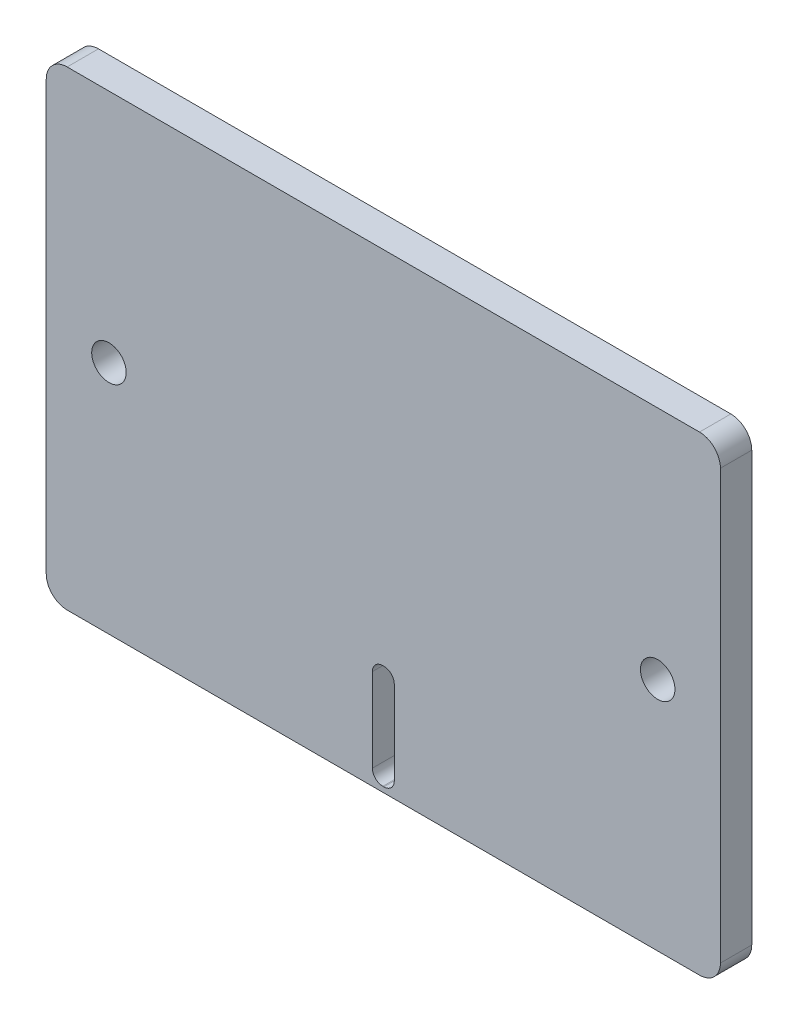
ISO-10303-21;
HEADER;
FILE_DESCRIPTION(('STEP AP214'),'2;1');
FILE_NAME('part.step','',(''),(''),'','','');
FILE_SCHEMA(('AUTOMOTIVE_DESIGN { 1 0 10303 214 1 1 1 1 }'));
ENDSEC;
DATA;
#1=APPLICATION_CONTEXT('core data for automotive mechanical design processes');
#2=APPLICATION_PROTOCOL_DEFINITION('international standard','automotive_design',2000,#1);
#3=PRODUCT_CONTEXT('',#1,'mechanical');
#4=PRODUCT('Part','Part','',(#3));
#5=PRODUCT_RELATED_PRODUCT_CATEGORY('part','',(#4));
#6=PRODUCT_DEFINITION_FORMATION('','',#4);
#7=PRODUCT_DEFINITION_CONTEXT('part definition',#1,'design');
#8=PRODUCT_DEFINITION('design','',#6,#7);
#9=PRODUCT_DEFINITION_SHAPE('','',#8);
#10=(LENGTH_UNIT() NAMED_UNIT(*) SI_UNIT(.MILLI.,.METRE.));
#11=(NAMED_UNIT(*) PLANE_ANGLE_UNIT() SI_UNIT($,.RADIAN.));
#12=(NAMED_UNIT(*) SI_UNIT($,.STERADIAN.) SOLID_ANGLE_UNIT());
#13=UNCERTAINTY_MEASURE_WITH_UNIT(LENGTH_MEASURE(1.E-05),#10,'distance_accuracy_value','');
#14=(GEOMETRIC_REPRESENTATION_CONTEXT(3) GLOBAL_UNCERTAINTY_ASSIGNED_CONTEXT((#13)) GLOBAL_UNIT_ASSIGNED_CONTEXT((#10,
#11,#12)) REPRESENTATION_CONTEXT('',''));
#15=CARTESIAN_POINT('',(0.,0.,0.));
#16=DIRECTION('',(0.,0.,1.));
#17=DIRECTION('',(1.,0.,0.));
#18=AXIS2_PLACEMENT_3D('',#15,#16,#17);
#19=CARTESIAN_POINT('',(32.25,-22.5,3.));
#20=DIRECTION('',(-1.,0.,0.));
#21=DIRECTION('',(0.,0.,1.));
#22=AXIS2_PLACEMENT_3D('',#19,#20,#21);
#23=PLANE('',#22);
#24=DIRECTION('',(0.,0.,-1.));
#25=VECTOR('',#24,1.);
#26=CARTESIAN_POINT('',(32.25,-20.5,3.));
#27=LINE('',#26,#25);
#28=CARTESIAN_POINT('',(32.25,-20.5,3.));
#29=VERTEX_POINT('',#28);
#30=CARTESIAN_POINT('',(32.25,-20.5,0.));
#31=VERTEX_POINT('',#30);
#32=EDGE_CURVE('E203',#29,#31,#27,.T.);
#33=ORIENTED_EDGE('',*,*,#32,.T.);
#34=DIRECTION('',(0.,1.,0.));
#35=VECTOR('',#34,1.);
#36=CARTESIAN_POINT('',(32.25,-22.5,0.));
#37=LINE('',#36,#35);
#38=CARTESIAN_POINT('',(32.25,20.5,0.));
#39=VERTEX_POINT('',#38);
#40=EDGE_CURVE('E181',#31,#39,#37,.T.);
#41=ORIENTED_EDGE('',*,*,#40,.T.);
#42=DIRECTION('',(0.,0.,-1.));
#43=VECTOR('',#42,1.);
#44=CARTESIAN_POINT('',(32.25,20.5,3.));
#45=LINE('',#44,#43);
#46=CARTESIAN_POINT('',(32.25,20.5,3.));
#47=VERTEX_POINT('',#46);
#48=EDGE_CURVE('E200',#39,#47,#45,.F.);
#49=ORIENTED_EDGE('',*,*,#48,.T.);
#50=DIRECTION('',(0.,1.,0.));
#51=VECTOR('',#50,1.);
#52=CARTESIAN_POINT('',(32.25,-22.5,3.));
#53=LINE('',#52,#51);
#54=EDGE_CURVE('E179',#29,#47,#53,.T.);
#55=ORIENTED_EDGE('',*,*,#54,.F.);
#56=EDGE_LOOP('',(#33,#41,#49,#55));
#57=FACE_BOUND('',#56,.T.);
#58=ADVANCED_FACE('F36',(#57),#23,.F.);
#59=CARTESIAN_POINT('',(-32.25,22.5,3.));
#60=DIRECTION('',(0.,-1.,0.));
#61=DIRECTION('',(0.,0.,-1.));
#62=AXIS2_PLACEMENT_3D('',#59,#60,#61);
#63=PLANE('',#62);
#64=DIRECTION('',(-1.,0.,0.));
#65=VECTOR('',#64,1.);
#66=CARTESIAN_POINT('',(-32.25,22.5,0.));
#67=LINE('',#66,#65);
#68=CARTESIAN_POINT('',(30.25,22.5,0.));
#69=VERTEX_POINT('',#68);
#70=CARTESIAN_POINT('',(-30.25,22.5,0.));
#71=VERTEX_POINT('',#70);
#72=EDGE_CURVE('E176',#69,#71,#67,.T.);
#73=ORIENTED_EDGE('',*,*,#72,.T.);
#74=DIRECTION('',(0.,0.,-1.));
#75=VECTOR('',#74,1.);
#76=CARTESIAN_POINT('',(-30.25,22.5,3.));
#77=LINE('',#76,#75);
#78=CARTESIAN_POINT('',(-30.25,22.5,3.));
#79=VERTEX_POINT('',#78);
#80=EDGE_CURVE('E154',#71,#79,#77,.F.);
#81=ORIENTED_EDGE('',*,*,#80,.T.);
#82=DIRECTION('',(-1.,0.,0.));
#83=VECTOR('',#82,1.);
#84=CARTESIAN_POINT('',(-32.25,22.5,3.));
#85=LINE('',#84,#83);
#86=CARTESIAN_POINT('',(30.25,22.5,3.));
#87=VERTEX_POINT('',#86);
#88=EDGE_CURVE('E313',#87,#79,#85,.T.);
#89=ORIENTED_EDGE('',*,*,#88,.F.);
#90=DIRECTION('',(0.,0.,-1.));
#91=VECTOR('',#90,1.);
#92=CARTESIAN_POINT('',(30.25,22.5,3.));
#93=LINE('',#92,#91);
#94=EDGE_CURVE('E159',#87,#69,#93,.T.);
#95=ORIENTED_EDGE('',*,*,#94,.T.);
#96=EDGE_LOOP('',(#73,#81,#89,#95));
#97=FACE_BOUND('',#96,.T.);
#98=ADVANCED_FACE('F331',(#97),#63,.F.);
#99=CARTESIAN_POINT('',(-32.25,-22.5,3.));
#100=DIRECTION('',(1.,0.,0.));
#101=DIRECTION('',(0.,0.,-1.));
#102=AXIS2_PLACEMENT_3D('',#99,#100,#101);
#103=PLANE('',#102);
#104=DIRECTION('',(0.,-1.,0.));
#105=VECTOR('',#104,1.);
#106=CARTESIAN_POINT('',(-32.25,-22.5,0.));
#107=LINE('',#106,#105);
#108=CARTESIAN_POINT('',(-32.25,20.5,0.));
#109=VERTEX_POINT('',#108);
#110=CARTESIAN_POINT('',(-32.25,-20.5,0.));
#111=VERTEX_POINT('',#110);
#112=EDGE_CURVE('E166',#109,#111,#107,.T.);
#113=ORIENTED_EDGE('',*,*,#112,.T.);
#114=DIRECTION('',(0.,0.,-1.));
#115=VECTOR('',#114,1.);
#116=CARTESIAN_POINT('',(-32.25,-20.5,3.));
#117=LINE('',#116,#115);
#118=CARTESIAN_POINT('',(-32.25,-20.5,3.));
#119=VERTEX_POINT('',#118);
#120=EDGE_CURVE('E211',#111,#119,#117,.F.);
#121=ORIENTED_EDGE('',*,*,#120,.T.);
#122=DIRECTION('',(0.,-1.,0.));
#123=VECTOR('',#122,1.);
#124=CARTESIAN_POINT('',(-32.25,-22.5,3.));
#125=LINE('',#124,#123);
#126=CARTESIAN_POINT('',(-32.25,20.5,3.));
#127=VERTEX_POINT('',#126);
#128=EDGE_CURVE('E168',#127,#119,#125,.T.);
#129=ORIENTED_EDGE('',*,*,#128,.F.);
#130=DIRECTION('',(0.,0.,-1.));
#131=VECTOR('',#130,1.);
#132=CARTESIAN_POINT('',(-32.25,20.5,3.));
#133=LINE('',#132,#131);
#134=EDGE_CURVE('E153',#127,#109,#133,.T.);
#135=ORIENTED_EDGE('',*,*,#134,.T.);
#136=EDGE_LOOP('',(#113,#121,#129,#135));
#137=FACE_BOUND('',#136,.T.);
#138=ADVANCED_FACE('F164',(#137),#103,.F.);
#139=CARTESIAN_POINT('',(-32.25,-22.5,3.));
#140=DIRECTION('',(0.,1.,0.));
#141=DIRECTION('',(0.,0.,1.));
#142=AXIS2_PLACEMENT_3D('',#139,#140,#141);
#143=PLANE('',#142);
#144=DIRECTION('',(1.,0.,0.));
#145=VECTOR('',#144,1.);
#146=CARTESIAN_POINT('',(-32.25,-22.5,0.));
#147=LINE('',#146,#145);
#148=CARTESIAN_POINT('',(-30.25,-22.5,0.));
#149=VERTEX_POINT('',#148);
#150=CARTESIAN_POINT('',(30.25,-22.5,0.));
#151=VERTEX_POINT('',#150);
#152=EDGE_CURVE('E175',#149,#151,#147,.T.);
#153=ORIENTED_EDGE('',*,*,#152,.T.);
#154=DIRECTION('',(0.,0.,-1.));
#155=VECTOR('',#154,1.);
#156=CARTESIAN_POINT('',(30.25,-22.5,3.));
#157=LINE('',#156,#155);
#158=CARTESIAN_POINT('',(30.25,-22.5,3.));
#159=VERTEX_POINT('',#158);
#160=EDGE_CURVE('E209',#151,#159,#157,.F.);
#161=ORIENTED_EDGE('',*,*,#160,.T.);
#162=DIRECTION('',(1.,0.,0.));
#163=VECTOR('',#162,1.);
#164=CARTESIAN_POINT('',(-32.25,-22.5,3.));
#165=LINE('',#164,#163);
#166=CARTESIAN_POINT('',(-30.25,-22.5,3.));
#167=VERTEX_POINT('',#166);
#168=EDGE_CURVE('E170',#167,#159,#165,.T.);
#169=ORIENTED_EDGE('',*,*,#168,.F.);
#170=DIRECTION('',(0.,0.,-1.));
#171=VECTOR('',#170,1.);
#172=CARTESIAN_POINT('',(-30.25,-22.5,3.));
#173=LINE('',#172,#171);
#174=EDGE_CURVE('E206',#167,#149,#173,.T.);
#175=ORIENTED_EDGE('',*,*,#174,.T.);
#176=EDGE_LOOP('',(#153,#161,#169,#175));
#177=FACE_BOUND('',#176,.T.);
#178=ADVANCED_FACE('F338',(#177),#143,.F.);
#179=CARTESIAN_POINT('',(0.,0.,3.));
#180=DIRECTION('',(0.,0.,-1.));
#181=DIRECTION('',(-1.,0.,0.));
#182=AXIS2_PLACEMENT_3D('',#179,#180,#181);
#183=PLANE('',#182);
#184=DIRECTION('',(-1.,0.,0.));
#185=VECTOR('',#184,1.);
#186=CARTESIAN_POINT('',(-1.05,-12.,3.));
#187=LINE('',#186,#185);
#188=CARTESIAN_POINT('',(0.0500000000000023,-12.,3.));
#189=VERTEX_POINT('',#188);
#190=CARTESIAN_POINT('',(-0.0499999999999982,-12.,3.));
#191=VERTEX_POINT('',#190);
#192=EDGE_CURVE('E266',#189,#191,#187,.T.);
#193=ORIENTED_EDGE('',*,*,#192,.F.);
#194=CARTESIAN_POINT('',(0.0500000000000023,-13.,3.));
#195=DIRECTION('',(0.,0.,-1.));
#196=DIRECTION('',(-1.,0.,0.));
#197=AXIS2_PLACEMENT_3D('',#194,#195,#196);
#198=CIRCLE('',#197,1.);
#199=CARTESIAN_POINT('',(1.05,-13.,3.));
#200=VERTEX_POINT('',#199);
#201=EDGE_CURVE('E44',#189,#200,#198,.T.);
#202=ORIENTED_EDGE('',*,*,#201,.T.);
#203=DIRECTION('',(0.,1.,0.));
#204=VECTOR('',#203,1.);
#205=CARTESIAN_POINT('',(1.05,-12.,3.));
#206=LINE('',#205,#204);
#207=CARTESIAN_POINT('',(1.05,-21.,3.));
#208=VERTEX_POINT('',#207);
#209=EDGE_CURVE('E265',#208,#200,#206,.T.);
#210=ORIENTED_EDGE('',*,*,#209,.F.);
#211=CARTESIAN_POINT('',(0.0500000000000033,-21.,3.));
#212=DIRECTION('',(0.,0.,-1.));
#213=DIRECTION('',(-1.,0.,0.));
#214=AXIS2_PLACEMENT_3D('',#211,#212,#213);
#215=CIRCLE('',#214,1.);
#216=CARTESIAN_POINT('',(0.0500000000000032,-22.,3.));
#217=VERTEX_POINT('',#216);
#218=EDGE_CURVE('E251',#208,#217,#215,.T.);
#219=ORIENTED_EDGE('',*,*,#218,.T.);
#220=DIRECTION('',(1.,0.,0.));
#221=VECTOR('',#220,1.);
#222=CARTESIAN_POINT('',(-1.05,-22.,3.));
#223=LINE('',#222,#221);
#224=CARTESIAN_POINT('',(-0.0499999999999973,-22.,3.));
#225=VERTEX_POINT('',#224);
#226=EDGE_CURVE('E300',#225,#217,#223,.T.);
#227=ORIENTED_EDGE('',*,*,#226,.F.);
#228=CARTESIAN_POINT('',(-0.0499999999999973,-21.,3.));
#229=DIRECTION('',(0.,0.,-1.));
#230=DIRECTION('',(-1.,0.,0.));
#231=AXIS2_PLACEMENT_3D('',#228,#229,#230);
#232=CIRCLE('',#231,1.);
#233=CARTESIAN_POINT('',(-1.05,-21.,3.));
#234=VERTEX_POINT('',#233);
#235=EDGE_CURVE('E255',#225,#234,#232,.T.);
#236=ORIENTED_EDGE('',*,*,#235,.T.);
#237=DIRECTION('',(0.,-1.,0.));
#238=VECTOR('',#237,1.);
#239=CARTESIAN_POINT('',(-1.05,-12.,3.));
#240=LINE('',#239,#238);
#241=CARTESIAN_POINT('',(-1.05,-13.,3.));
#242=VERTEX_POINT('',#241);
#243=EDGE_CURVE('E289',#242,#234,#240,.T.);
#244=ORIENTED_EDGE('',*,*,#243,.F.);
#245=CARTESIAN_POINT('',(-0.0499999999999983,-13.,3.));
#246=DIRECTION('',(0.,0.,-1.));
#247=DIRECTION('',(-1.,0.,0.));
#248=AXIS2_PLACEMENT_3D('',#245,#246,#247);
#249=CIRCLE('',#248,1.);
#250=EDGE_CURVE('E51',#242,#191,#249,.T.);
#251=ORIENTED_EDGE('',*,*,#250,.T.);
#252=EDGE_LOOP('',(#193,#202,#210,#219,#227,#236,#244,#251));
#253=FACE_BOUND('',#252,.T.);
#254=CARTESIAN_POINT('',(-26.25,0.,3.));
#255=DIRECTION('',(0.,0.,1.));
#256=DIRECTION('',(1.,0.,0.));
#257=AXIS2_PLACEMENT_3D('',#254,#255,#256);
#258=CIRCLE('',#257,1.65);
#259=CARTESIAN_POINT('',(-24.6,0.,3.));
#260=VERTEX_POINT('',#259);
#261=EDGE_CURVE('E218',#260,#260,#258,.T.);
#262=ORIENTED_EDGE('',*,*,#261,.F.);
#263=EDGE_LOOP('',(#262));
#264=FACE_BOUND('',#263,.T.);
#265=CARTESIAN_POINT('',(26.25,0.,3.));
#266=DIRECTION('',(0.,0.,1.));
#267=DIRECTION('',(-1.,0.,0.));
#268=AXIS2_PLACEMENT_3D('',#265,#266,#267);
#269=CIRCLE('',#268,1.65);
#270=CARTESIAN_POINT('',(24.6,0.,3.));
#271=VERTEX_POINT('',#270);
#272=EDGE_CURVE('E303',#271,#271,#269,.T.);
#273=ORIENTED_EDGE('',*,*,#272,.F.);
#274=EDGE_LOOP('',(#273));
#275=FACE_BOUND('',#274,.T.);
#276=ORIENTED_EDGE('',*,*,#128,.T.);
#277=CARTESIAN_POINT('',(-30.25,-20.5,3.));
#278=DIRECTION('',(0.,0.,-1.));
#279=DIRECTION('',(-1.,0.,0.));
#280=AXIS2_PLACEMENT_3D('',#277,#278,#279);
#281=CIRCLE('',#280,2.);
#282=EDGE_CURVE('E192',#119,#167,#281,.F.);
#283=ORIENTED_EDGE('',*,*,#282,.T.);
#284=ORIENTED_EDGE('',*,*,#168,.T.);
#285=CARTESIAN_POINT('',(30.25,-20.5,3.));
#286=DIRECTION('',(0.,0.,-1.));
#287=DIRECTION('',(-1.,0.,0.));
#288=AXIS2_PLACEMENT_3D('',#285,#286,#287);
#289=CIRCLE('',#288,2.);
#290=EDGE_CURVE('E194',#159,#29,#289,.F.);
#291=ORIENTED_EDGE('',*,*,#290,.T.);
#292=ORIENTED_EDGE('',*,*,#54,.T.);
#293=CARTESIAN_POINT('',(30.25,20.5,3.));
#294=DIRECTION('',(0.,0.,-1.));
#295=DIRECTION('',(-1.,0.,0.));
#296=AXIS2_PLACEMENT_3D('',#293,#294,#295);
#297=CIRCLE('',#296,2.);
#298=EDGE_CURVE('E196',#47,#87,#297,.F.);
#299=ORIENTED_EDGE('',*,*,#298,.T.);
#300=ORIENTED_EDGE('',*,*,#88,.T.);
#301=CARTESIAN_POINT('',(-30.25,20.5,3.));
#302=DIRECTION('',(0.,0.,-1.));
#303=DIRECTION('',(-1.,0.,0.));
#304=AXIS2_PLACEMENT_3D('',#301,#302,#303);
#305=CIRCLE('',#304,2.);
#306=EDGE_CURVE('E198',#79,#127,#305,.F.);
#307=ORIENTED_EDGE('',*,*,#306,.T.);
#308=EDGE_LOOP('',(#276,#283,#284,#291,#292,#299,#300,#307));
#309=FACE_BOUND('',#308,.T.);
#310=ADVANCED_FACE('F263',(#253,#264,#275,#309),#183,.F.);
#311=CARTESIAN_POINT('',(0.,0.,0.));
#312=DIRECTION('',(0.,0.,-1.));
#313=DIRECTION('',(-1.,0.,0.));
#314=AXIS2_PLACEMENT_3D('',#311,#312,#313);
#315=PLANE('',#314);
#316=DIRECTION('',(0.,-1.,0.));
#317=VECTOR('',#316,1.);
#318=CARTESIAN_POINT('',(1.05,0.,0.));
#319=LINE('',#318,#317);
#320=CARTESIAN_POINT('',(1.05,-13.,0.));
#321=VERTEX_POINT('',#320);
#322=CARTESIAN_POINT('',(1.05,-21.,0.));
#323=VERTEX_POINT('',#322);
#324=EDGE_CURVE('E229',#321,#323,#319,.T.);
#325=ORIENTED_EDGE('',*,*,#324,.F.);
#326=CARTESIAN_POINT('',(0.0500000000000023,-13.,0.));
#327=DIRECTION('',(0.,0.,-1.));
#328=DIRECTION('',(-1.,0.,0.));
#329=AXIS2_PLACEMENT_3D('',#326,#327,#328);
#330=CIRCLE('',#329,1.);
#331=CARTESIAN_POINT('',(0.0500000000000023,-12.,0.));
#332=VERTEX_POINT('',#331);
#333=EDGE_CURVE('E11',#321,#332,#330,.F.);
#334=ORIENTED_EDGE('',*,*,#333,.T.);
#335=DIRECTION('',(1.,0.,0.));
#336=VECTOR('',#335,1.);
#337=CARTESIAN_POINT('',(0.,-12.,0.));
#338=LINE('',#337,#336);
#339=CARTESIAN_POINT('',(-0.0499999999999983,-12.,0.));
#340=VERTEX_POINT('',#339);
#341=EDGE_CURVE('E213',#340,#332,#338,.T.);
#342=ORIENTED_EDGE('',*,*,#341,.F.);
#343=CARTESIAN_POINT('',(-0.0499999999999983,-13.,0.));
#344=DIRECTION('',(0.,0.,-1.));
#345=DIRECTION('',(-1.,0.,0.));
#346=AXIS2_PLACEMENT_3D('',#343,#344,#345);
#347=CIRCLE('',#346,1.);
#348=CARTESIAN_POINT('',(-1.05,-13.,0.));
#349=VERTEX_POINT('',#348);
#350=EDGE_CURVE('E260',#340,#349,#347,.F.);
#351=ORIENTED_EDGE('',*,*,#350,.T.);
#352=DIRECTION('',(0.,1.,0.));
#353=VECTOR('',#352,1.);
#354=CARTESIAN_POINT('',(-1.05,0.,0.));
#355=LINE('',#354,#353);
#356=CARTESIAN_POINT('',(-1.05,-21.,0.));
#357=VERTEX_POINT('',#356);
#358=EDGE_CURVE('E223',#357,#349,#355,.T.);
#359=ORIENTED_EDGE('',*,*,#358,.F.);
#360=CARTESIAN_POINT('',(-0.0499999999999973,-21.,0.));
#361=DIRECTION('',(0.,0.,-1.));
#362=DIRECTION('',(-1.,0.,0.));
#363=AXIS2_PLACEMENT_3D('',#360,#361,#362);
#364=CIRCLE('',#363,1.);
#365=CARTESIAN_POINT('',(-0.0499999999999973,-22.,0.));
#366=VERTEX_POINT('',#365);
#367=EDGE_CURVE('E257',#357,#366,#364,.F.);
#368=ORIENTED_EDGE('',*,*,#367,.T.);
#369=DIRECTION('',(-1.,0.,0.));
#370=VECTOR('',#369,1.);
#371=CARTESIAN_POINT('',(0.,-22.,0.));
#372=LINE('',#371,#370);
#373=CARTESIAN_POINT('',(0.0500000000000033,-22.,0.));
#374=VERTEX_POINT('',#373);
#375=EDGE_CURVE('E226',#374,#366,#372,.T.);
#376=ORIENTED_EDGE('',*,*,#375,.F.);
#377=CARTESIAN_POINT('',(0.0500000000000033,-21.,0.));
#378=DIRECTION('',(0.,0.,-1.));
#379=DIRECTION('',(-1.,0.,0.));
#380=AXIS2_PLACEMENT_3D('',#377,#378,#379);
#381=CIRCLE('',#380,1.);
#382=EDGE_CURVE('E253',#374,#323,#381,.F.);
#383=ORIENTED_EDGE('',*,*,#382,.T.);
#384=EDGE_LOOP('',(#325,#334,#342,#351,#359,#368,#376,#383));
#385=FACE_BOUND('',#384,.T.);
#386=CARTESIAN_POINT('',(-26.25,0.,0.));
#387=DIRECTION('',(0.,0.,-1.));
#388=DIRECTION('',(-1.,0.,0.));
#389=AXIS2_PLACEMENT_3D('',#386,#387,#388);
#390=CIRCLE('',#389,1.65);
#391=CARTESIAN_POINT('',(-27.9,0.,0.));
#392=VERTEX_POINT('',#391);
#393=EDGE_CURVE('E217',#392,#392,#390,.T.);
#394=ORIENTED_EDGE('',*,*,#393,.F.);
#395=EDGE_LOOP('',(#394));
#396=FACE_BOUND('',#395,.T.);
#397=CARTESIAN_POINT('',(26.25,0.,0.));
#398=DIRECTION('',(0.,0.,-1.));
#399=DIRECTION('',(-1.,0.,0.));
#400=AXIS2_PLACEMENT_3D('',#397,#398,#399);
#401=CIRCLE('',#400,1.65);
#402=CARTESIAN_POINT('',(24.6,0.,0.));
#403=VERTEX_POINT('',#402);
#404=EDGE_CURVE('E214',#403,#403,#401,.T.);
#405=ORIENTED_EDGE('',*,*,#404,.F.);
#406=EDGE_LOOP('',(#405));
#407=FACE_BOUND('',#406,.T.);
#408=CARTESIAN_POINT('',(-30.25,-20.5,0.));
#409=DIRECTION('',(0.,0.,-1.));
#410=DIRECTION('',(-1.,0.,0.));
#411=AXIS2_PLACEMENT_3D('',#408,#409,#410);
#412=CIRCLE('',#411,2.);
#413=EDGE_CURVE('E169',#149,#111,#412,.T.);
#414=ORIENTED_EDGE('',*,*,#413,.T.);
#415=ORIENTED_EDGE('',*,*,#112,.F.);
#416=CARTESIAN_POINT('',(-30.25,20.5,0.));
#417=DIRECTION('',(0.,0.,-1.));
#418=DIRECTION('',(-1.,0.,0.));
#419=AXIS2_PLACEMENT_3D('',#416,#417,#418);
#420=CIRCLE('',#419,2.);
#421=EDGE_CURVE('E149',#109,#71,#420,.T.);
#422=ORIENTED_EDGE('',*,*,#421,.T.);
#423=ORIENTED_EDGE('',*,*,#72,.F.);
#424=CARTESIAN_POINT('',(30.25,20.5,0.));
#425=DIRECTION('',(0.,0.,-1.));
#426=DIRECTION('',(-1.,0.,0.));
#427=AXIS2_PLACEMENT_3D('',#424,#425,#426);
#428=CIRCLE('',#427,2.);
#429=EDGE_CURVE('E160',#69,#39,#428,.T.);
#430=ORIENTED_EDGE('',*,*,#429,.T.);
#431=ORIENTED_EDGE('',*,*,#40,.F.);
#432=CARTESIAN_POINT('',(30.25,-20.5,0.));
#433=DIRECTION('',(0.,0.,-1.));
#434=DIRECTION('',(-1.,0.,0.));
#435=AXIS2_PLACEMENT_3D('',#432,#433,#434);
#436=CIRCLE('',#435,2.);
#437=EDGE_CURVE('E186',#31,#151,#436,.T.);
#438=ORIENTED_EDGE('',*,*,#437,.T.);
#439=ORIENTED_EDGE('',*,*,#152,.F.);
#440=EDGE_LOOP('',(#414,#415,#422,#423,#430,#431,#438,#439));
#441=FACE_BOUND('',#440,.T.);
#442=ADVANCED_FACE('F172',(#385,#396,#407,#441),#315,.T.);
#443=CARTESIAN_POINT('',(-30.25,20.5,3.));
#444=DIRECTION('',(0.,0.,-1.));
#445=DIRECTION('',(-1.,0.,0.));
#446=AXIS2_PLACEMENT_3D('',#443,#444,#445);
#447=CYLINDRICAL_SURFACE('',#446,2.);
#448=ORIENTED_EDGE('',*,*,#306,.F.);
#449=ORIENTED_EDGE('',*,*,#80,.F.);
#450=ORIENTED_EDGE('',*,*,#421,.F.);
#451=ORIENTED_EDGE('',*,*,#134,.F.);
#452=EDGE_LOOP('',(#448,#449,#450,#451));
#453=FACE_BOUND('',#452,.T.);
#454=ADVANCED_FACE('F152',(#453),#447,.T.);
#455=CARTESIAN_POINT('',(30.25,20.5,3.));
#456=DIRECTION('',(0.,0.,-1.));
#457=DIRECTION('',(-1.,0.,0.));
#458=AXIS2_PLACEMENT_3D('',#455,#456,#457);
#459=CYLINDRICAL_SURFACE('',#458,2.);
#460=ORIENTED_EDGE('',*,*,#298,.F.);
#461=ORIENTED_EDGE('',*,*,#48,.F.);
#462=ORIENTED_EDGE('',*,*,#429,.F.);
#463=ORIENTED_EDGE('',*,*,#94,.F.);
#464=EDGE_LOOP('',(#460,#461,#462,#463));
#465=FACE_BOUND('',#464,.T.);
#466=ADVANCED_FACE('F326',(#465),#459,.T.);
#467=CARTESIAN_POINT('',(30.25,-20.5,3.));
#468=DIRECTION('',(0.,0.,-1.));
#469=DIRECTION('',(-1.,0.,0.));
#470=AXIS2_PLACEMENT_3D('',#467,#468,#469);
#471=CYLINDRICAL_SURFACE('',#470,2.);
#472=ORIENTED_EDGE('',*,*,#290,.F.);
#473=ORIENTED_EDGE('',*,*,#160,.F.);
#474=ORIENTED_EDGE('',*,*,#437,.F.);
#475=ORIENTED_EDGE('',*,*,#32,.F.);
#476=EDGE_LOOP('',(#472,#473,#474,#475));
#477=FACE_BOUND('',#476,.T.);
#478=ADVANCED_FACE('F347',(#477),#471,.T.);
#479=CARTESIAN_POINT('',(-30.25,-20.5,3.));
#480=DIRECTION('',(0.,0.,-1.));
#481=DIRECTION('',(-1.,0.,0.));
#482=AXIS2_PLACEMENT_3D('',#479,#480,#481);
#483=CYLINDRICAL_SURFACE('',#482,2.);
#484=ORIENTED_EDGE('',*,*,#282,.F.);
#485=ORIENTED_EDGE('',*,*,#120,.F.);
#486=ORIENTED_EDGE('',*,*,#413,.F.);
#487=ORIENTED_EDGE('',*,*,#174,.F.);
#488=EDGE_LOOP('',(#484,#485,#486,#487));
#489=FACE_BOUND('',#488,.T.);
#490=ADVANCED_FACE('F350',(#489),#483,.T.);
#491=CARTESIAN_POINT('',(26.25,0.,-7.));
#492=DIRECTION('',(0.,0.,1.));
#493=DIRECTION('',(1.,0.,0.));
#494=AXIS2_PLACEMENT_3D('',#491,#492,#493);
#495=CYLINDRICAL_SURFACE('',#494,1.65);
#496=ORIENTED_EDGE('',*,*,#404,.T.);
#497=EDGE_LOOP('',(#496));
#498=FACE_BOUND('',#497,.T.);
#499=ORIENTED_EDGE('',*,*,#272,.T.);
#500=EDGE_LOOP('',(#499));
#501=FACE_BOUND('',#500,.T.);
#502=ADVANCED_FACE('F354',(#498,#501),#495,.F.);
#503=CARTESIAN_POINT('',(-26.25,0.,-7.));
#504=DIRECTION('',(0.,0.,1.));
#505=DIRECTION('',(1.,0.,0.));
#506=AXIS2_PLACEMENT_3D('',#503,#504,#505);
#507=CYLINDRICAL_SURFACE('',#506,1.65);
#508=ORIENTED_EDGE('',*,*,#393,.T.);
#509=EDGE_LOOP('',(#508));
#510=FACE_BOUND('',#509,.T.);
#511=ORIENTED_EDGE('',*,*,#261,.T.);
#512=EDGE_LOOP('',(#511));
#513=FACE_BOUND('',#512,.T.);
#514=ADVANCED_FACE('F414',(#510,#513),#507,.F.);
#515=CARTESIAN_POINT('',(1.05,-12.,-7.));
#516=DIRECTION('',(1.,0.,0.));
#517=DIRECTION('',(0.,1.,0.));
#518=AXIS2_PLACEMENT_3D('',#515,#516,#517);
#519=PLANE('',#518);
#520=ORIENTED_EDGE('',*,*,#324,.T.);
#521=DIRECTION('',(0.,0.,1.));
#522=VECTOR('',#521,1.);
#523=CARTESIAN_POINT('',(1.05,-21.,3.));
#524=LINE('',#523,#522);
#525=EDGE_CURVE('E234',#323,#208,#524,.T.);
#526=ORIENTED_EDGE('',*,*,#525,.T.);
#527=ORIENTED_EDGE('',*,*,#209,.T.);
#528=DIRECTION('',(0.,0.,1.));
#529=VECTOR('',#528,1.);
#530=CARTESIAN_POINT('',(1.05,-13.,0.));
#531=LINE('',#530,#529);
#532=EDGE_CURVE('E232',#200,#321,#531,.F.);
#533=ORIENTED_EDGE('',*,*,#532,.T.);
#534=EDGE_LOOP('',(#520,#526,#527,#533));
#535=FACE_BOUND('',#534,.T.);
#536=ADVANCED_FACE('F268',(#535),#519,.F.);
#537=CARTESIAN_POINT('',(-1.05,-22.,-7.));
#538=DIRECTION('',(0.,-1.,0.));
#539=DIRECTION('',(0.,0.,-1.));
#540=AXIS2_PLACEMENT_3D('',#537,#538,#539);
#541=PLANE('',#540);
#542=ORIENTED_EDGE('',*,*,#226,.T.);
#543=DIRECTION('',(0.,0.,1.));
#544=VECTOR('',#543,1.);
#545=CARTESIAN_POINT('',(0.0500000000000033,-22.,0.));
#546=LINE('',#545,#544);
#547=EDGE_CURVE('E240',#217,#374,#546,.F.);
#548=ORIENTED_EDGE('',*,*,#547,.T.);
#549=ORIENTED_EDGE('',*,*,#375,.T.);
#550=DIRECTION('',(0.,0.,1.));
#551=VECTOR('',#550,1.);
#552=CARTESIAN_POINT('',(-0.0499999999999973,-22.,3.));
#553=LINE('',#552,#551);
#554=EDGE_CURVE('E237',#366,#225,#553,.T.);
#555=ORIENTED_EDGE('',*,*,#554,.T.);
#556=EDGE_LOOP('',(#542,#548,#549,#555));
#557=FACE_BOUND('',#556,.T.);
#558=ADVANCED_FACE('F297',(#557),#541,.F.);
#559=CARTESIAN_POINT('',(-1.05,-12.,-7.));
#560=DIRECTION('',(-1.,0.,0.));
#561=DIRECTION('',(0.,-1.,0.));
#562=AXIS2_PLACEMENT_3D('',#559,#560,#561);
#563=PLANE('',#562);
#564=ORIENTED_EDGE('',*,*,#243,.T.);
#565=DIRECTION('',(0.,0.,1.));
#566=VECTOR('',#565,1.);
#567=CARTESIAN_POINT('',(-1.05,-21.,0.));
#568=LINE('',#567,#566);
#569=EDGE_CURVE('E245',#234,#357,#568,.F.);
#570=ORIENTED_EDGE('',*,*,#569,.T.);
#571=ORIENTED_EDGE('',*,*,#358,.T.);
#572=DIRECTION('',(0.,0.,1.));
#573=VECTOR('',#572,1.);
#574=CARTESIAN_POINT('',(-1.05,-13.,3.));
#575=LINE('',#574,#573);
#576=EDGE_CURVE('E242',#349,#242,#575,.T.);
#577=ORIENTED_EDGE('',*,*,#576,.T.);
#578=EDGE_LOOP('',(#564,#570,#571,#577));
#579=FACE_BOUND('',#578,.T.);
#580=ADVANCED_FACE('F287',(#579),#563,.F.);
#581=CARTESIAN_POINT('',(-1.05,-12.,-7.));
#582=DIRECTION('',(0.,1.,0.));
#583=DIRECTION('',(0.,0.,1.));
#584=AXIS2_PLACEMENT_3D('',#581,#582,#583);
#585=PLANE('',#584);
#586=ORIENTED_EDGE('',*,*,#192,.T.);
#587=DIRECTION('',(0.,0.,1.));
#588=VECTOR('',#587,1.);
#589=CARTESIAN_POINT('',(-0.0499999999999983,-12.,0.));
#590=LINE('',#589,#588);
#591=EDGE_CURVE('E249',#191,#340,#590,.F.);
#592=ORIENTED_EDGE('',*,*,#591,.T.);
#593=ORIENTED_EDGE('',*,*,#341,.T.);
#594=DIRECTION('',(0.,0.,1.));
#595=VECTOR('',#594,1.);
#596=CARTESIAN_POINT('',(0.0500000000000023,-12.,3.));
#597=LINE('',#596,#595);
#598=EDGE_CURVE('E247',#332,#189,#597,.T.);
#599=ORIENTED_EDGE('',*,*,#598,.T.);
#600=EDGE_LOOP('',(#586,#592,#593,#599));
#601=FACE_BOUND('',#600,.T.);
#602=ADVANCED_FACE('F278',(#601),#585,.F.);
#603=CARTESIAN_POINT('',(0.0500000000000033,-21.,-7.));
#604=DIRECTION('',(0.,0.,-1.));
#605=DIRECTION('',(-1.,0.,0.));
#606=AXIS2_PLACEMENT_3D('',#603,#604,#605);
#607=CYLINDRICAL_SURFACE('',#606,1.);
#608=ORIENTED_EDGE('',*,*,#382,.F.);
#609=ORIENTED_EDGE('',*,*,#547,.F.);
#610=ORIENTED_EDGE('',*,*,#218,.F.);
#611=ORIENTED_EDGE('',*,*,#525,.F.);
#612=EDGE_LOOP('',(#608,#609,#610,#611));
#613=FACE_BOUND('',#612,.T.);
#614=ADVANCED_FACE('F302',(#613),#607,.F.);
#615=CARTESIAN_POINT('',(-0.0499999999999973,-21.,-7.));
#616=DIRECTION('',(0.,0.,-1.));
#617=DIRECTION('',(-1.,0.,0.));
#618=AXIS2_PLACEMENT_3D('',#615,#616,#617);
#619=CYLINDRICAL_SURFACE('',#618,1.);
#620=ORIENTED_EDGE('',*,*,#367,.F.);
#621=ORIENTED_EDGE('',*,*,#569,.F.);
#622=ORIENTED_EDGE('',*,*,#235,.F.);
#623=ORIENTED_EDGE('',*,*,#554,.F.);
#624=EDGE_LOOP('',(#620,#621,#622,#623));
#625=FACE_BOUND('',#624,.T.);
#626=ADVANCED_FACE('F291',(#625),#619,.F.);
#627=CARTESIAN_POINT('',(-0.0499999999999983,-13.,-7.));
#628=DIRECTION('',(0.,0.,-1.));
#629=DIRECTION('',(-1.,0.,0.));
#630=AXIS2_PLACEMENT_3D('',#627,#628,#629);
#631=CYLINDRICAL_SURFACE('',#630,1.);
#632=ORIENTED_EDGE('',*,*,#350,.F.);
#633=ORIENTED_EDGE('',*,*,#591,.F.);
#634=ORIENTED_EDGE('',*,*,#250,.F.);
#635=ORIENTED_EDGE('',*,*,#576,.F.);
#636=EDGE_LOOP('',(#632,#633,#634,#635));
#637=FACE_BOUND('',#636,.T.);
#638=ADVANCED_FACE('F281',(#637),#631,.F.);
#639=CARTESIAN_POINT('',(0.0500000000000023,-13.,-7.));
#640=DIRECTION('',(0.,0.,-1.));
#641=DIRECTION('',(-1.,0.,0.));
#642=AXIS2_PLACEMENT_3D('',#639,#640,#641);
#643=CYLINDRICAL_SURFACE('',#642,1.);
#644=ORIENTED_EDGE('',*,*,#333,.F.);
#645=ORIENTED_EDGE('',*,*,#532,.F.);
#646=ORIENTED_EDGE('',*,*,#201,.F.);
#647=ORIENTED_EDGE('',*,*,#598,.F.);
#648=EDGE_LOOP('',(#644,#645,#646,#647));
#649=FACE_BOUND('',#648,.T.);
#650=ADVANCED_FACE('F38',(#649),#643,.F.);
#651=CLOSED_SHELL('',(#58,#98,#138,#178,#310,#442,#454,#466,#478,#490,#502,#514,#536,#558,#580,
#602,#614,#626,#638,#650));
#652=MANIFOLD_SOLID_BREP('B2',#651);
#653=ADVANCED_BREP_SHAPE_REPRESENTATION('',(#18,#652),#14);
#654=SHAPE_DEFINITION_REPRESENTATION(#9,#653);
ENDSEC;
END-ISO-10303-21;
